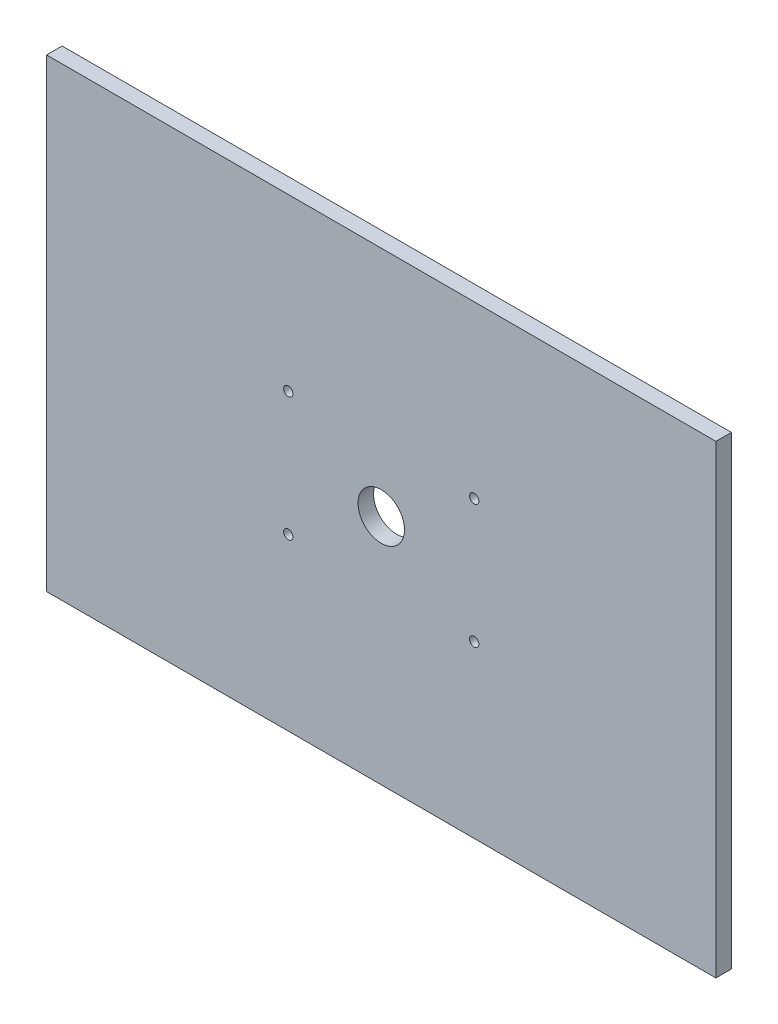
ISO-10303-21;
HEADER;
FILE_DESCRIPTION(('STEP AP214'),'2;1');
FILE_NAME('part.step','',(''),(''),'','','');
FILE_SCHEMA(('AUTOMOTIVE_DESIGN { 1 0 10303 214 1 1 1 1 }'));
ENDSEC;
DATA;
#1=APPLICATION_CONTEXT('core data for automotive mechanical design processes');
#2=APPLICATION_PROTOCOL_DEFINITION('international standard','automotive_design',2000,#1);
#3=PRODUCT_CONTEXT('',#1,'mechanical');
#4=PRODUCT('Part','Part','',(#3));
#5=PRODUCT_RELATED_PRODUCT_CATEGORY('part','',(#4));
#6=PRODUCT_DEFINITION_FORMATION('','',#4);
#7=PRODUCT_DEFINITION_CONTEXT('part definition',#1,'design');
#8=PRODUCT_DEFINITION('design','',#6,#7);
#9=PRODUCT_DEFINITION_SHAPE('','',#8);
#10=(LENGTH_UNIT() NAMED_UNIT(*) SI_UNIT(.MILLI.,.METRE.));
#11=(NAMED_UNIT(*) PLANE_ANGLE_UNIT() SI_UNIT($,.RADIAN.));
#12=(NAMED_UNIT(*) SI_UNIT($,.STERADIAN.) SOLID_ANGLE_UNIT());
#13=UNCERTAINTY_MEASURE_WITH_UNIT(LENGTH_MEASURE(1.E-05),#10,'distance_accuracy_value','');
#14=(GEOMETRIC_REPRESENTATION_CONTEXT(3) GLOBAL_UNCERTAINTY_ASSIGNED_CONTEXT((#13)) GLOBAL_UNIT_ASSIGNED_CONTEXT((#10,
#11,#12)) REPRESENTATION_CONTEXT('',''));
#15=CARTESIAN_POINT('',(0.,0.,0.));
#16=DIRECTION('',(0.,0.,1.));
#17=DIRECTION('',(1.,0.,0.));
#18=AXIS2_PLACEMENT_3D('',#15,#16,#17);
#19=CARTESIAN_POINT('',(-137.16,-95.25,6.35));
#20=DIRECTION('',(1.,0.,0.));
#21=DIRECTION('',(0.,0.,-1.));
#22=AXIS2_PLACEMENT_3D('',#19,#20,#21);
#23=PLANE('',#22);
#24=DIRECTION('',(0.,-1.,0.));
#25=VECTOR('',#24,1.);
#26=CARTESIAN_POINT('',(-137.16,-95.25,0.));
#27=LINE('',#26,#25);
#28=CARTESIAN_POINT('',(-137.16,95.25,0.));
#29=VERTEX_POINT('',#28);
#30=CARTESIAN_POINT('',(-137.16,-95.25,0.));
#31=VERTEX_POINT('',#30);
#32=EDGE_CURVE('E99',#29,#31,#27,.T.);
#33=ORIENTED_EDGE('',*,*,#32,.T.);
#34=DIRECTION('',(0.,0.,-1.));
#35=VECTOR('',#34,1.);
#36=CARTESIAN_POINT('',(-137.16,-95.25,6.35));
#37=LINE('',#36,#35);
#38=CARTESIAN_POINT('',(-137.16,-95.25,6.35));
#39=VERTEX_POINT('',#38);
#40=EDGE_CURVE('E11',#39,#31,#37,.T.);
#41=ORIENTED_EDGE('',*,*,#40,.F.);
#42=DIRECTION('',(0.,-1.,0.));
#43=VECTOR('',#42,1.);
#44=CARTESIAN_POINT('',(-137.16,-95.25,6.35));
#45=LINE('',#44,#43);
#46=CARTESIAN_POINT('',(-137.16,95.25,6.35));
#47=VERTEX_POINT('',#46);
#48=EDGE_CURVE('E87',#47,#39,#45,.T.);
#49=ORIENTED_EDGE('',*,*,#48,.F.);
#50=DIRECTION('',(0.,0.,-1.));
#51=VECTOR('',#50,1.);
#52=CARTESIAN_POINT('',(-137.16,95.25,6.35));
#53=LINE('',#52,#51);
#54=EDGE_CURVE('E95',#47,#29,#53,.T.);
#55=ORIENTED_EDGE('',*,*,#54,.T.);
#56=EDGE_LOOP('',(#33,#41,#49,#55));
#57=FACE_BOUND('',#56,.T.);
#58=ADVANCED_FACE('F36',(#57),#23,.F.);
#59=CARTESIAN_POINT('',(137.16,-95.25,6.35));
#60=DIRECTION('',(0.,1.,0.));
#61=DIRECTION('',(-1.,0.,0.));
#62=AXIS2_PLACEMENT_3D('',#59,#60,#61);
#63=PLANE('',#62);
#64=DIRECTION('',(1.,0.,0.));
#65=VECTOR('',#64,1.);
#66=CARTESIAN_POINT('',(137.16,-95.25,0.));
#67=LINE('',#66,#65);
#68=CARTESIAN_POINT('',(137.16,-95.25,0.));
#69=VERTEX_POINT('',#68);
#70=EDGE_CURVE('E91',#31,#69,#67,.T.);
#71=ORIENTED_EDGE('',*,*,#70,.T.);
#72=DIRECTION('',(0.,0.,-1.));
#73=VECTOR('',#72,1.);
#74=CARTESIAN_POINT('',(137.16,-95.25,6.35));
#75=LINE('',#74,#73);
#76=CARTESIAN_POINT('',(137.16,-95.25,6.35));
#77=VERTEX_POINT('',#76);
#78=EDGE_CURVE('E44',#77,#69,#75,.T.);
#79=ORIENTED_EDGE('',*,*,#78,.F.);
#80=DIRECTION('',(1.,0.,0.));
#81=VECTOR('',#80,1.);
#82=CARTESIAN_POINT('',(137.16,-95.25,6.35));
#83=LINE('',#82,#81);
#84=EDGE_CURVE('E82',#39,#77,#83,.T.);
#85=ORIENTED_EDGE('',*,*,#84,.F.);
#86=ORIENTED_EDGE('',*,*,#40,.T.);
#87=EDGE_LOOP('',(#71,#79,#85,#86));
#88=FACE_BOUND('',#87,.T.);
#89=ADVANCED_FACE('F90',(#88),#63,.F.);
#90=CARTESIAN_POINT('',(137.16,-95.25,6.35));
#91=DIRECTION('',(-1.,0.,0.));
#92=DIRECTION('',(0.,0.,1.));
#93=AXIS2_PLACEMENT_3D('',#90,#91,#92);
#94=PLANE('',#93);
#95=DIRECTION('',(0.,1.,0.));
#96=VECTOR('',#95,1.);
#97=CARTESIAN_POINT('',(137.16,-95.25,0.));
#98=LINE('',#97,#96);
#99=CARTESIAN_POINT('',(137.16,95.2500000000001,0.));
#100=VERTEX_POINT('',#99);
#101=EDGE_CURVE('E69',#69,#100,#98,.T.);
#102=ORIENTED_EDGE('',*,*,#101,.T.);
#103=DIRECTION('',(0.,0.,-1.));
#104=VECTOR('',#103,1.);
#105=CARTESIAN_POINT('',(137.16,95.2500000000001,6.35));
#106=LINE('',#105,#104);
#107=CARTESIAN_POINT('',(137.16,95.2500000000001,6.35));
#108=VERTEX_POINT('',#107);
#109=EDGE_CURVE('E92',#108,#100,#106,.T.);
#110=ORIENTED_EDGE('',*,*,#109,.F.);
#111=DIRECTION('',(0.,1.,0.));
#112=VECTOR('',#111,1.);
#113=CARTESIAN_POINT('',(137.16,-95.25,6.35));
#114=LINE('',#113,#112);
#115=EDGE_CURVE('E85',#77,#108,#114,.T.);
#116=ORIENTED_EDGE('',*,*,#115,.F.);
#117=ORIENTED_EDGE('',*,*,#78,.T.);
#118=EDGE_LOOP('',(#102,#110,#116,#117));
#119=FACE_BOUND('',#118,.T.);
#120=ADVANCED_FACE('F93',(#119),#94,.F.);
#121=CARTESIAN_POINT('',(137.16,95.2500000000001,6.35));
#122=DIRECTION('',(0.,-1.,0.));
#123=DIRECTION('',(1.,0.,0.));
#124=AXIS2_PLACEMENT_3D('',#121,#122,#123);
#125=PLANE('',#124);
#126=DIRECTION('',(-1.,0.,0.));
#127=VECTOR('',#126,1.);
#128=CARTESIAN_POINT('',(137.16,95.2500000000001,0.));
#129=LINE('',#128,#127);
#130=EDGE_CURVE('E75',#100,#29,#129,.T.);
#131=ORIENTED_EDGE('',*,*,#130,.T.);
#132=ORIENTED_EDGE('',*,*,#54,.F.);
#133=DIRECTION('',(-1.,0.,0.));
#134=VECTOR('',#133,1.);
#135=CARTESIAN_POINT('',(137.16,95.2500000000001,6.35));
#136=LINE('',#135,#134);
#137=EDGE_CURVE('E52',#108,#47,#136,.T.);
#138=ORIENTED_EDGE('',*,*,#137,.F.);
#139=ORIENTED_EDGE('',*,*,#109,.T.);
#140=EDGE_LOOP('',(#131,#132,#138,#139));
#141=FACE_BOUND('',#140,.T.);
#142=ADVANCED_FACE('F107',(#141),#125,.F.);
#143=CARTESIAN_POINT('',(0.,0.,6.35));
#144=DIRECTION('',(0.,0.,1.));
#145=DIRECTION('',(1.,0.,0.));
#146=AXIS2_PLACEMENT_3D('',#143,#144,#145);
#147=PLANE('',#146);
#148=CARTESIAN_POINT('',(38.1,25.4,6.35));
#149=DIRECTION('',(0.,0.,1.));
#150=DIRECTION('',(1.,0.,0.));
#151=AXIS2_PLACEMENT_3D('',#148,#149,#150);
#152=CIRCLE('',#151,1.90500000000001);
#153=CARTESIAN_POINT('',(40.005,25.4,6.35));
#154=VERTEX_POINT('',#153);
#155=EDGE_CURVE('E125',#154,#154,#152,.T.);
#156=ORIENTED_EDGE('',*,*,#155,.F.);
#157=EDGE_LOOP('',(#156));
#158=FACE_BOUND('',#157,.T.);
#159=CARTESIAN_POINT('',(38.1,-25.4,6.35));
#160=DIRECTION('',(0.,0.,1.));
#161=DIRECTION('',(1.,0.,0.));
#162=AXIS2_PLACEMENT_3D('',#159,#160,#161);
#163=CIRCLE('',#162,1.90500000000001);
#164=CARTESIAN_POINT('',(40.005,-25.4,6.35));
#165=VERTEX_POINT('',#164);
#166=EDGE_CURVE('E131',#165,#165,#163,.T.);
#167=ORIENTED_EDGE('',*,*,#166,.F.);
#168=EDGE_LOOP('',(#167));
#169=FACE_BOUND('',#168,.T.);
#170=CARTESIAN_POINT('',(-38.1,-25.4,6.35));
#171=DIRECTION('',(0.,0.,1.));
#172=DIRECTION('',(1.,0.,0.));
#173=AXIS2_PLACEMENT_3D('',#170,#171,#172);
#174=CIRCLE('',#173,1.90500000000001);
#175=CARTESIAN_POINT('',(-36.195,-25.4,6.35));
#176=VERTEX_POINT('',#175);
#177=EDGE_CURVE('E137',#176,#176,#174,.T.);
#178=ORIENTED_EDGE('',*,*,#177,.F.);
#179=EDGE_LOOP('',(#178));
#180=FACE_BOUND('',#179,.T.);
#181=CARTESIAN_POINT('',(-38.1,25.4,6.35));
#182=DIRECTION('',(0.,0.,1.));
#183=DIRECTION('',(1.,0.,0.));
#184=AXIS2_PLACEMENT_3D('',#181,#182,#183);
#185=CIRCLE('',#184,1.90500000000001);
#186=CARTESIAN_POINT('',(-36.195,25.4,6.35));
#187=VERTEX_POINT('',#186);
#188=EDGE_CURVE('E119',#187,#187,#185,.T.);
#189=ORIENTED_EDGE('',*,*,#188,.F.);
#190=EDGE_LOOP('',(#189));
#191=FACE_BOUND('',#190,.T.);
#192=CARTESIAN_POINT('',(0.,0.,6.35));
#193=DIRECTION('',(0.,0.,1.));
#194=DIRECTION('',(1.,0.,0.));
#195=AXIS2_PLACEMENT_3D('',#192,#193,#194);
#196=CIRCLE('',#195,9.525);
#197=CARTESIAN_POINT('',(9.525,0.,6.35));
#198=VERTEX_POINT('',#197);
#199=EDGE_CURVE('E113',#198,#198,#196,.T.);
#200=ORIENTED_EDGE('',*,*,#199,.F.);
#201=EDGE_LOOP('',(#200));
#202=FACE_BOUND('',#201,.T.);
#203=ORIENTED_EDGE('',*,*,#48,.T.);
#204=ORIENTED_EDGE('',*,*,#84,.T.);
#205=ORIENTED_EDGE('',*,*,#115,.T.);
#206=ORIENTED_EDGE('',*,*,#137,.T.);
#207=EDGE_LOOP('',(#203,#204,#205,#206));
#208=FACE_BOUND('',#207,.T.);
#209=ADVANCED_FACE('F83',(#158,#169,#180,#191,#202,#208),#147,.T.);
#210=CARTESIAN_POINT('',(0.,0.,0.));
#211=DIRECTION('',(0.,0.,1.));
#212=DIRECTION('',(1.,0.,0.));
#213=AXIS2_PLACEMENT_3D('',#210,#211,#212);
#214=PLANE('',#213);
#215=CARTESIAN_POINT('',(38.1,25.4,0.));
#216=DIRECTION('',(0.,0.,1.));
#217=DIRECTION('',(1.,0.,0.));
#218=AXIS2_PLACEMENT_3D('',#215,#216,#217);
#219=CIRCLE('',#218,1.90500000000001);
#220=CARTESIAN_POINT('',(40.005,25.4,0.));
#221=VERTEX_POINT('',#220);
#222=EDGE_CURVE('E128',#221,#221,#219,.T.);
#223=ORIENTED_EDGE('',*,*,#222,.T.);
#224=EDGE_LOOP('',(#223));
#225=FACE_BOUND('',#224,.T.);
#226=CARTESIAN_POINT('',(38.1,-25.4,0.));
#227=DIRECTION('',(0.,0.,1.));
#228=DIRECTION('',(1.,0.,0.));
#229=AXIS2_PLACEMENT_3D('',#226,#227,#228);
#230=CIRCLE('',#229,1.90500000000001);
#231=CARTESIAN_POINT('',(40.005,-25.4,0.));
#232=VERTEX_POINT('',#231);
#233=EDGE_CURVE('E134',#232,#232,#230,.T.);
#234=ORIENTED_EDGE('',*,*,#233,.T.);
#235=EDGE_LOOP('',(#234));
#236=FACE_BOUND('',#235,.T.);
#237=CARTESIAN_POINT('',(-38.1,-25.4,0.));
#238=DIRECTION('',(0.,0.,1.));
#239=DIRECTION('',(1.,0.,0.));
#240=AXIS2_PLACEMENT_3D('',#237,#238,#239);
#241=CIRCLE('',#240,1.90500000000001);
#242=CARTESIAN_POINT('',(-36.195,-25.4,0.));
#243=VERTEX_POINT('',#242);
#244=EDGE_CURVE('E122',#243,#243,#241,.T.);
#245=ORIENTED_EDGE('',*,*,#244,.T.);
#246=EDGE_LOOP('',(#245));
#247=FACE_BOUND('',#246,.T.);
#248=CARTESIAN_POINT('',(-38.1,25.4,0.));
#249=DIRECTION('',(0.,0.,1.));
#250=DIRECTION('',(1.,0.,0.));
#251=AXIS2_PLACEMENT_3D('',#248,#249,#250);
#252=CIRCLE('',#251,1.90500000000001);
#253=CARTESIAN_POINT('',(-36.195,25.4,0.));
#254=VERTEX_POINT('',#253);
#255=EDGE_CURVE('E116',#254,#254,#252,.T.);
#256=ORIENTED_EDGE('',*,*,#255,.T.);
#257=EDGE_LOOP('',(#256));
#258=FACE_BOUND('',#257,.T.);
#259=CARTESIAN_POINT('',(0.,0.,0.));
#260=DIRECTION('',(0.,0.,1.));
#261=DIRECTION('',(1.,0.,0.));
#262=AXIS2_PLACEMENT_3D('',#259,#260,#261);
#263=CIRCLE('',#262,9.525);
#264=CARTESIAN_POINT('',(9.525,0.,0.));
#265=VERTEX_POINT('',#264);
#266=EDGE_CURVE('E102',#265,#265,#263,.T.);
#267=ORIENTED_EDGE('',*,*,#266,.T.);
#268=EDGE_LOOP('',(#267));
#269=FACE_BOUND('',#268,.T.);
#270=ORIENTED_EDGE('',*,*,#32,.F.);
#271=ORIENTED_EDGE('',*,*,#130,.F.);
#272=ORIENTED_EDGE('',*,*,#101,.F.);
#273=ORIENTED_EDGE('',*,*,#70,.F.);
#274=EDGE_LOOP('',(#270,#271,#272,#273));
#275=FACE_BOUND('',#274,.T.);
#276=ADVANCED_FACE('F110',(#225,#236,#247,#258,#269,#275),#214,.F.);
#277=CARTESIAN_POINT('',(0.,0.,0.));
#278=DIRECTION('',(0.,0.,1.));
#279=DIRECTION('',(1.,0.,0.));
#280=AXIS2_PLACEMENT_3D('',#277,#278,#279);
#281=CYLINDRICAL_SURFACE('',#280,9.525);
#282=ORIENTED_EDGE('',*,*,#266,.F.);
#283=EDGE_LOOP('',(#282));
#284=FACE_BOUND('',#283,.T.);
#285=ORIENTED_EDGE('',*,*,#199,.T.);
#286=EDGE_LOOP('',(#285));
#287=FACE_BOUND('',#286,.T.);
#288=ADVANCED_FACE('F161',(#284,#287),#281,.F.);
#289=CARTESIAN_POINT('',(-38.1,25.4,0.));
#290=DIRECTION('',(0.,0.,1.));
#291=DIRECTION('',(1.,0.,0.));
#292=AXIS2_PLACEMENT_3D('',#289,#290,#291);
#293=CYLINDRICAL_SURFACE('',#292,1.90500000000001);
#294=ORIENTED_EDGE('',*,*,#255,.F.);
#295=EDGE_LOOP('',(#294));
#296=FACE_BOUND('',#295,.T.);
#297=ORIENTED_EDGE('',*,*,#188,.T.);
#298=EDGE_LOOP('',(#297));
#299=FACE_BOUND('',#298,.T.);
#300=ADVANCED_FACE('F149',(#296,#299),#293,.F.);
#301=CARTESIAN_POINT('',(-38.1,-25.4,0.));
#302=DIRECTION('',(0.,0.,1.));
#303=DIRECTION('',(1.,0.,0.));
#304=AXIS2_PLACEMENT_3D('',#301,#302,#303);
#305=CYLINDRICAL_SURFACE('',#304,1.90500000000001);
#306=ORIENTED_EDGE('',*,*,#244,.F.);
#307=EDGE_LOOP('',(#306));
#308=FACE_BOUND('',#307,.T.);
#309=ORIENTED_EDGE('',*,*,#177,.T.);
#310=EDGE_LOOP('',(#309));
#311=FACE_BOUND('',#310,.T.);
#312=ADVANCED_FACE('F145',(#308,#311),#305,.F.);
#313=CARTESIAN_POINT('',(38.1,-25.4,0.));
#314=DIRECTION('',(0.,0.,1.));
#315=DIRECTION('',(1.,0.,0.));
#316=AXIS2_PLACEMENT_3D('',#313,#314,#315);
#317=CYLINDRICAL_SURFACE('',#316,1.90500000000001);
#318=ORIENTED_EDGE('',*,*,#233,.F.);
#319=EDGE_LOOP('',(#318));
#320=FACE_BOUND('',#319,.T.);
#321=ORIENTED_EDGE('',*,*,#166,.T.);
#322=EDGE_LOOP('',(#321));
#323=FACE_BOUND('',#322,.T.);
#324=ADVANCED_FACE('F148',(#320,#323),#317,.F.);
#325=CARTESIAN_POINT('',(38.1,25.4,0.));
#326=DIRECTION('',(0.,0.,1.));
#327=DIRECTION('',(1.,0.,0.));
#328=AXIS2_PLACEMENT_3D('',#325,#326,#327);
#329=CYLINDRICAL_SURFACE('',#328,1.90500000000001);
#330=ORIENTED_EDGE('',*,*,#222,.F.);
#331=EDGE_LOOP('',(#330));
#332=FACE_BOUND('',#331,.T.);
#333=ORIENTED_EDGE('',*,*,#155,.T.);
#334=EDGE_LOOP('',(#333));
#335=FACE_BOUND('',#334,.T.);
#336=ADVANCED_FACE('F218',(#332,#335),#329,.F.);
#337=CLOSED_SHELL('',(#58,#89,#120,#142,#209,#276,#288,#300,#312,#324,#336));
#338=MANIFOLD_SOLID_BREP('B2',#337);
#339=ADVANCED_BREP_SHAPE_REPRESENTATION('',(#18,#338),#14);
#340=SHAPE_DEFINITION_REPRESENTATION(#9,#339);
ENDSEC;
END-ISO-10303-21;
